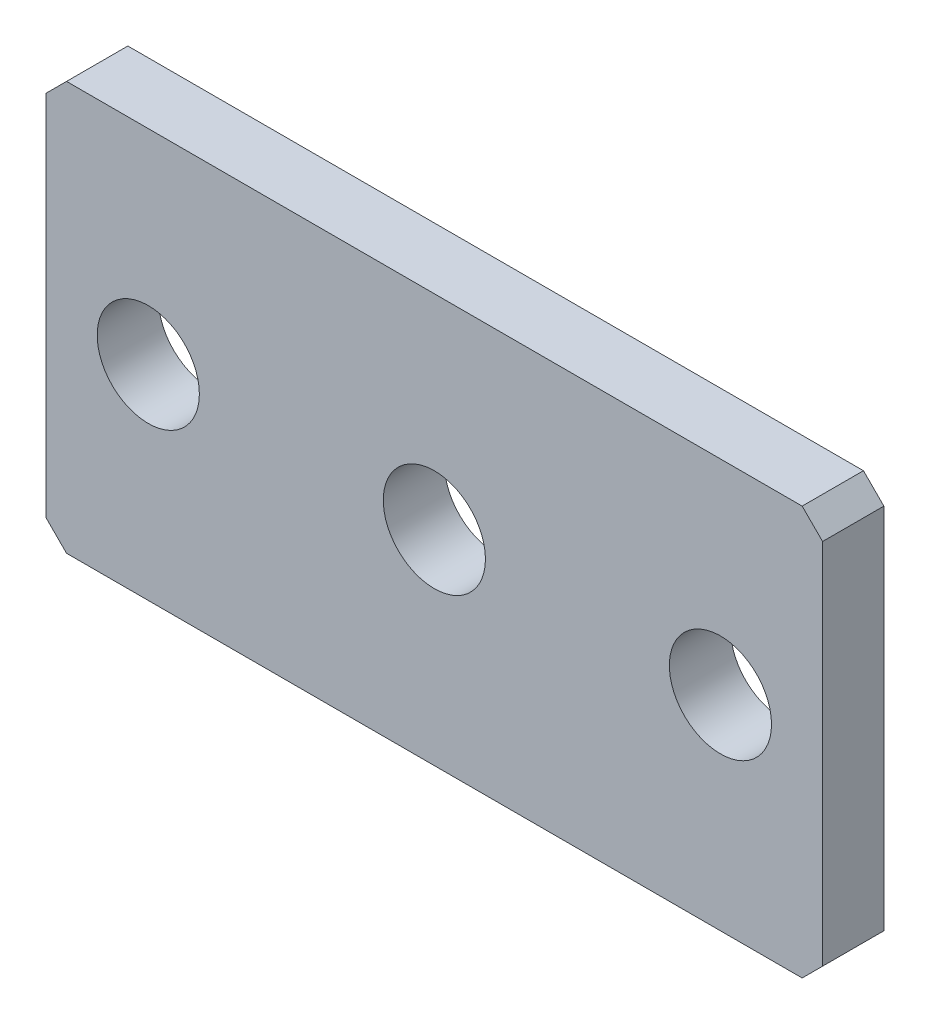
ISO-10303-21;
HEADER;
FILE_DESCRIPTION(('STEP AP214'),'2;1');
FILE_NAME('part.step','',(''),(''),'','','');
FILE_SCHEMA(('AUTOMOTIVE_DESIGN { 1 0 10303 214 1 1 1 1 }'));
ENDSEC;
DATA;
#1=APPLICATION_CONTEXT('core data for automotive mechanical design processes');
#2=APPLICATION_PROTOCOL_DEFINITION('international standard','automotive_design',2000,#1);
#3=PRODUCT_CONTEXT('',#1,'mechanical');
#4=PRODUCT('Part','Part','',(#3));
#5=PRODUCT_RELATED_PRODUCT_CATEGORY('part','',(#4));
#6=PRODUCT_DEFINITION_FORMATION('','',#4);
#7=PRODUCT_DEFINITION_CONTEXT('part definition',#1,'design');
#8=PRODUCT_DEFINITION('design','',#6,#7);
#9=PRODUCT_DEFINITION_SHAPE('','',#8);
#10=(LENGTH_UNIT() NAMED_UNIT(*) SI_UNIT(.MILLI.,.METRE.));
#11=(NAMED_UNIT(*) PLANE_ANGLE_UNIT() SI_UNIT($,.RADIAN.));
#12=(NAMED_UNIT(*) SI_UNIT($,.STERADIAN.) SOLID_ANGLE_UNIT());
#13=UNCERTAINTY_MEASURE_WITH_UNIT(LENGTH_MEASURE(1.E-05),#10,'distance_accuracy_value','');
#14=(GEOMETRIC_REPRESENTATION_CONTEXT(3) GLOBAL_UNCERTAINTY_ASSIGNED_CONTEXT((#13)) GLOBAL_UNIT_ASSIGNED_CONTEXT((#10,
#11,#12)) REPRESENTATION_CONTEXT('',''));
#15=CARTESIAN_POINT('',(0.,0.,0.));
#16=DIRECTION('',(0.,0.,1.));
#17=DIRECTION('',(1.,0.,0.));
#18=AXIS2_PLACEMENT_3D('',#15,#16,#17);
#19=CARTESIAN_POINT('',(-18.,10.,-3.));
#20=DIRECTION('',(-0.707106781186547,0.707106781186548,0.));
#21=DIRECTION('',(-0.707106781186548,-0.707106781186547,0.));
#22=AXIS2_PLACEMENT_3D('',#19,#20,#21);
#23=PLANE('',#22);
#24=DIRECTION('',(-0.707106781186548,-0.707106781186547,0.));
#25=VECTOR('',#24,1.);
#26=CARTESIAN_POINT('',(-18.,10.,0.));
#27=LINE('',#26,#25);
#28=CARTESIAN_POINT('',(-18.,10.,0.));
#29=VERTEX_POINT('',#28);
#30=CARTESIAN_POINT('',(-19.,9.,0.));
#31=VERTEX_POINT('',#30);
#32=EDGE_CURVE('E133',#29,#31,#27,.T.);
#33=ORIENTED_EDGE('',*,*,#32,.F.);
#34=DIRECTION('',(0.,0.,1.));
#35=VECTOR('',#34,1.);
#36=CARTESIAN_POINT('',(-18.,10.,-3.));
#37=LINE('',#36,#35);
#38=CARTESIAN_POINT('',(-18.,10.,-3.));
#39=VERTEX_POINT('',#38);
#40=EDGE_CURVE('E11',#39,#29,#37,.T.);
#41=ORIENTED_EDGE('',*,*,#40,.F.);
#42=DIRECTION('',(-0.707106781186548,-0.707106781186547,0.));
#43=VECTOR('',#42,1.);
#44=CARTESIAN_POINT('',(-18.,10.,-3.));
#45=LINE('',#44,#43);
#46=CARTESIAN_POINT('',(-19.,9.,-3.));
#47=VERTEX_POINT('',#46);
#48=EDGE_CURVE('E154',#39,#47,#45,.T.);
#49=ORIENTED_EDGE('',*,*,#48,.T.);
#50=DIRECTION('',(0.,0.,1.));
#51=VECTOR('',#50,1.);
#52=CARTESIAN_POINT('',(-19.,9.,-3.));
#53=LINE('',#52,#51);
#54=EDGE_CURVE('E39',#47,#31,#53,.T.);
#55=ORIENTED_EDGE('',*,*,#54,.T.);
#56=EDGE_LOOP('',(#33,#41,#49,#55));
#57=FACE_BOUND('',#56,.T.);
#58=ADVANCED_FACE('F36',(#57),#23,.T.);
#59=CARTESIAN_POINT('',(-18.,10.,-3.));
#60=DIRECTION('',(0.,1.,0.));
#61=DIRECTION('',(-1.,0.,0.));
#62=AXIS2_PLACEMENT_3D('',#59,#60,#61);
#63=PLANE('',#62);
#64=DIRECTION('',(-1.,0.,0.));
#65=VECTOR('',#64,1.);
#66=CARTESIAN_POINT('',(-18.,10.,0.));
#67=LINE('',#66,#65);
#68=CARTESIAN_POINT('',(18.,9.99999999999999,0.));
#69=VERTEX_POINT('',#68);
#70=EDGE_CURVE('E152',#69,#29,#67,.T.);
#71=ORIENTED_EDGE('',*,*,#70,.F.);
#72=DIRECTION('',(0.,0.,1.));
#73=VECTOR('',#72,1.);
#74=CARTESIAN_POINT('',(18.,9.99999999999999,-3.));
#75=LINE('',#74,#73);
#76=CARTESIAN_POINT('',(18.,9.99999999999999,-3.));
#77=VERTEX_POINT('',#76);
#78=EDGE_CURVE('E45',#77,#69,#75,.T.);
#79=ORIENTED_EDGE('',*,*,#78,.F.);
#80=DIRECTION('',(-1.,0.,0.));
#81=VECTOR('',#80,1.);
#82=CARTESIAN_POINT('',(-18.,10.,-3.));
#83=LINE('',#82,#81);
#84=EDGE_CURVE('E123',#77,#39,#83,.T.);
#85=ORIENTED_EDGE('',*,*,#84,.T.);
#86=ORIENTED_EDGE('',*,*,#40,.T.);
#87=EDGE_LOOP('',(#71,#79,#85,#86));
#88=FACE_BOUND('',#87,.T.);
#89=ADVANCED_FACE('F166',(#88),#63,.T.);
#90=CARTESIAN_POINT('',(18.,9.99999999999999,-3.));
#91=DIRECTION('',(0.707106781186546,0.707106781186549,0.));
#92=DIRECTION('',(-0.707106781186549,0.707106781186546,0.));
#93=AXIS2_PLACEMENT_3D('',#90,#91,#92);
#94=PLANE('',#93);
#95=DIRECTION('',(-0.707106781186549,0.707106781186546,0.));
#96=VECTOR('',#95,1.);
#97=CARTESIAN_POINT('',(18.,9.99999999999999,0.));
#98=LINE('',#97,#96);
#99=CARTESIAN_POINT('',(19.,9.,0.));
#100=VERTEX_POINT('',#99);
#101=EDGE_CURVE('E110',#100,#69,#98,.T.);
#102=ORIENTED_EDGE('',*,*,#101,.F.);
#103=DIRECTION('',(0.,0.,1.));
#104=VECTOR('',#103,1.);
#105=CARTESIAN_POINT('',(19.,9.,-3.));
#106=LINE('',#105,#104);
#107=CARTESIAN_POINT('',(19.,9.,-3.));
#108=VERTEX_POINT('',#107);
#109=EDGE_CURVE('E105',#108,#100,#106,.T.);
#110=ORIENTED_EDGE('',*,*,#109,.F.);
#111=DIRECTION('',(-0.707106781186549,0.707106781186546,0.));
#112=VECTOR('',#111,1.);
#113=CARTESIAN_POINT('',(18.,9.99999999999999,-3.));
#114=LINE('',#113,#112);
#115=EDGE_CURVE('E108',#108,#77,#114,.T.);
#116=ORIENTED_EDGE('',*,*,#115,.T.);
#117=ORIENTED_EDGE('',*,*,#78,.T.);
#118=EDGE_LOOP('',(#102,#110,#116,#117));
#119=FACE_BOUND('',#118,.T.);
#120=ADVANCED_FACE('F107',(#119),#94,.T.);
#121=CARTESIAN_POINT('',(19.,9.,-3.));
#122=DIRECTION('',(1.,0.,0.));
#123=DIRECTION('',(0.,1.,0.));
#124=AXIS2_PLACEMENT_3D('',#121,#122,#123);
#125=PLANE('',#124);
#126=DIRECTION('',(0.,1.,0.));
#127=VECTOR('',#126,1.);
#128=CARTESIAN_POINT('',(19.,9.,0.));
#129=LINE('',#128,#127);
#130=CARTESIAN_POINT('',(19.,-9.,0.));
#131=VERTEX_POINT('',#130);
#132=EDGE_CURVE('E149',#131,#100,#129,.T.);
#133=ORIENTED_EDGE('',*,*,#132,.F.);
#134=DIRECTION('',(0.,0.,1.));
#135=VECTOR('',#134,1.);
#136=CARTESIAN_POINT('',(19.,-9.,-3.));
#137=LINE('',#136,#135);
#138=CARTESIAN_POINT('',(19.,-9.,-3.));
#139=VERTEX_POINT('',#138);
#140=EDGE_CURVE('E115',#139,#131,#137,.T.);
#141=ORIENTED_EDGE('',*,*,#140,.F.);
#142=DIRECTION('',(0.,1.,0.));
#143=VECTOR('',#142,1.);
#144=CARTESIAN_POINT('',(19.,9.,-3.));
#145=LINE('',#144,#143);
#146=EDGE_CURVE('E121',#139,#108,#145,.T.);
#147=ORIENTED_EDGE('',*,*,#146,.T.);
#148=ORIENTED_EDGE('',*,*,#109,.T.);
#149=EDGE_LOOP('',(#133,#141,#147,#148));
#150=FACE_BOUND('',#149,.T.);
#151=ADVANCED_FACE('F125',(#150),#125,.T.);
#152=CARTESIAN_POINT('',(19.,-9.,-3.));
#153=DIRECTION('',(0.707106781186546,-0.707106781186549,0.));
#154=DIRECTION('',(0.707106781186549,0.707106781186546,0.));
#155=AXIS2_PLACEMENT_3D('',#152,#153,#154);
#156=PLANE('',#155);
#157=DIRECTION('',(0.707106781186549,0.707106781186546,0.));
#158=VECTOR('',#157,1.);
#159=CARTESIAN_POINT('',(19.,-9.,0.));
#160=LINE('',#159,#158);
#161=CARTESIAN_POINT('',(18.,-10.,0.));
#162=VERTEX_POINT('',#161);
#163=EDGE_CURVE('E146',#162,#131,#160,.T.);
#164=ORIENTED_EDGE('',*,*,#163,.F.);
#165=DIRECTION('',(0.,0.,1.));
#166=VECTOR('',#165,1.);
#167=CARTESIAN_POINT('',(18.,-10.,-3.));
#168=LINE('',#167,#166);
#169=CARTESIAN_POINT('',(18.,-10.,-3.));
#170=VERTEX_POINT('',#169);
#171=EDGE_CURVE('E158',#170,#162,#168,.T.);
#172=ORIENTED_EDGE('',*,*,#171,.F.);
#173=DIRECTION('',(0.707106781186549,0.707106781186546,0.));
#174=VECTOR('',#173,1.);
#175=CARTESIAN_POINT('',(19.,-9.,-3.));
#176=LINE('',#175,#174);
#177=EDGE_CURVE('E126',#170,#139,#176,.T.);
#178=ORIENTED_EDGE('',*,*,#177,.T.);
#179=ORIENTED_EDGE('',*,*,#140,.T.);
#180=EDGE_LOOP('',(#164,#172,#178,#179));
#181=FACE_BOUND('',#180,.T.);
#182=ADVANCED_FACE('F179',(#181),#156,.T.);
#183=CARTESIAN_POINT('',(-18.,-10.,-3.));
#184=DIRECTION('',(0.,-1.,0.));
#185=DIRECTION('',(1.,0.,0.));
#186=AXIS2_PLACEMENT_3D('',#183,#184,#185);
#187=PLANE('',#186);
#188=DIRECTION('',(1.,0.,0.));
#189=VECTOR('',#188,1.);
#190=CARTESIAN_POINT('',(-18.,-10.,0.));
#191=LINE('',#190,#189);
#192=CARTESIAN_POINT('',(-18.,-10.,0.));
#193=VERTEX_POINT('',#192);
#194=EDGE_CURVE('E143',#193,#162,#191,.T.);
#195=ORIENTED_EDGE('',*,*,#194,.F.);
#196=DIRECTION('',(0.,0.,1.));
#197=VECTOR('',#196,1.);
#198=CARTESIAN_POINT('',(-18.,-10.,-3.));
#199=LINE('',#198,#197);
#200=CARTESIAN_POINT('',(-18.,-10.,-3.));
#201=VERTEX_POINT('',#200);
#202=EDGE_CURVE('E160',#201,#193,#199,.T.);
#203=ORIENTED_EDGE('',*,*,#202,.F.);
#204=DIRECTION('',(1.,0.,0.));
#205=VECTOR('',#204,1.);
#206=CARTESIAN_POINT('',(-18.,-10.,-3.));
#207=LINE('',#206,#205);
#208=EDGE_CURVE('E128',#201,#170,#207,.T.);
#209=ORIENTED_EDGE('',*,*,#208,.T.);
#210=ORIENTED_EDGE('',*,*,#171,.T.);
#211=EDGE_LOOP('',(#195,#203,#209,#210));
#212=FACE_BOUND('',#211,.T.);
#213=ADVANCED_FACE('F182',(#212),#187,.T.);
#214=CARTESIAN_POINT('',(-19.,-9.00000000000001,-3.));
#215=DIRECTION('',(-0.707106781186547,-0.707106781186548,0.));
#216=DIRECTION('',(0.707106781186548,-0.707106781186547,0.));
#217=AXIS2_PLACEMENT_3D('',#214,#215,#216);
#218=PLANE('',#217);
#219=DIRECTION('',(0.707106781186548,-0.707106781186547,0.));
#220=VECTOR('',#219,1.);
#221=CARTESIAN_POINT('',(-19.,-9.00000000000001,0.));
#222=LINE('',#221,#220);
#223=CARTESIAN_POINT('',(-19.,-9.00000000000001,0.));
#224=VERTEX_POINT('',#223);
#225=EDGE_CURVE('E140',#224,#193,#222,.T.);
#226=ORIENTED_EDGE('',*,*,#225,.F.);
#227=DIRECTION('',(0.,0.,1.));
#228=VECTOR('',#227,1.);
#229=CARTESIAN_POINT('',(-19.,-9.00000000000001,-3.));
#230=LINE('',#229,#228);
#231=CARTESIAN_POINT('',(-19.,-9.00000000000001,-3.));
#232=VERTEX_POINT('',#231);
#233=EDGE_CURVE('E161',#232,#224,#230,.T.);
#234=ORIENTED_EDGE('',*,*,#233,.F.);
#235=DIRECTION('',(0.707106781186548,-0.707106781186547,0.));
#236=VECTOR('',#235,1.);
#237=CARTESIAN_POINT('',(-19.,-9.00000000000001,-3.));
#238=LINE('',#237,#236);
#239=EDGE_CURVE('E238',#232,#201,#238,.T.);
#240=ORIENTED_EDGE('',*,*,#239,.T.);
#241=ORIENTED_EDGE('',*,*,#202,.T.);
#242=EDGE_LOOP('',(#226,#234,#240,#241));
#243=FACE_BOUND('',#242,.T.);
#244=ADVANCED_FACE('F186',(#243),#218,.T.);
#245=CARTESIAN_POINT('',(-19.,9.,-3.));
#246=DIRECTION('',(-1.,0.,0.));
#247=DIRECTION('',(0.,-1.,0.));
#248=AXIS2_PLACEMENT_3D('',#245,#246,#247);
#249=PLANE('',#248);
#250=DIRECTION('',(0.,-1.,0.));
#251=VECTOR('',#250,1.);
#252=CARTESIAN_POINT('',(-19.,9.,0.));
#253=LINE('',#252,#251);
#254=EDGE_CURVE('E136',#31,#224,#253,.T.);
#255=ORIENTED_EDGE('',*,*,#254,.F.);
#256=ORIENTED_EDGE('',*,*,#54,.F.);
#257=DIRECTION('',(0.,-1.,0.));
#258=VECTOR('',#257,1.);
#259=CARTESIAN_POINT('',(-19.,9.,-3.));
#260=LINE('',#259,#258);
#261=EDGE_CURVE('E236',#47,#232,#260,.T.);
#262=ORIENTED_EDGE('',*,*,#261,.T.);
#263=ORIENTED_EDGE('',*,*,#233,.T.);
#264=EDGE_LOOP('',(#255,#256,#262,#263));
#265=FACE_BOUND('',#264,.T.);
#266=ADVANCED_FACE('F163',(#265),#249,.T.);
#267=CARTESIAN_POINT('',(0.,0.,-3.));
#268=DIRECTION('',(0.,0.,1.));
#269=DIRECTION('',(1.,0.,0.));
#270=AXIS2_PLACEMENT_3D('',#267,#268,#269);
#271=PLANE('',#270);
#272=CARTESIAN_POINT('',(0.,0.,-3.));
#273=DIRECTION('',(0.,0.,1.));
#274=DIRECTION('',(1.,0.,0.));
#275=AXIS2_PLACEMENT_3D('',#272,#273,#274);
#276=CIRCLE('',#275,2.49999999999999);
#277=CARTESIAN_POINT('',(2.49999999999999,0.,-3.));
#278=VERTEX_POINT('',#277);
#279=EDGE_CURVE('E220',#278,#278,#276,.T.);
#280=ORIENTED_EDGE('',*,*,#279,.T.);
#281=EDGE_LOOP('',(#280));
#282=FACE_BOUND('',#281,.T.);
#283=CARTESIAN_POINT('',(14.,0.,-3.));
#284=DIRECTION('',(0.,0.,1.));
#285=DIRECTION('',(1.,0.,0.));
#286=AXIS2_PLACEMENT_3D('',#283,#284,#285);
#287=CIRCLE('',#286,2.5);
#288=CARTESIAN_POINT('',(16.5,0.,-3.));
#289=VERTEX_POINT('',#288);
#290=EDGE_CURVE('E224',#289,#289,#287,.T.);
#291=ORIENTED_EDGE('',*,*,#290,.T.);
#292=EDGE_LOOP('',(#291));
#293=FACE_BOUND('',#292,.T.);
#294=CARTESIAN_POINT('',(-14.,0.,-3.));
#295=DIRECTION('',(0.,0.,1.));
#296=DIRECTION('',(1.,0.,0.));
#297=AXIS2_PLACEMENT_3D('',#294,#295,#296);
#298=CIRCLE('',#297,2.5);
#299=CARTESIAN_POINT('',(-11.5,0.,-3.));
#300=VERTEX_POINT('',#299);
#301=EDGE_CURVE('E137',#300,#300,#298,.T.);
#302=ORIENTED_EDGE('',*,*,#301,.T.);
#303=EDGE_LOOP('',(#302));
#304=FACE_BOUND('',#303,.T.);
#305=ORIENTED_EDGE('',*,*,#48,.F.);
#306=ORIENTED_EDGE('',*,*,#84,.F.);
#307=ORIENTED_EDGE('',*,*,#115,.F.);
#308=ORIENTED_EDGE('',*,*,#146,.F.);
#309=ORIENTED_EDGE('',*,*,#177,.F.);
#310=ORIENTED_EDGE('',*,*,#208,.F.);
#311=ORIENTED_EDGE('',*,*,#239,.F.);
#312=ORIENTED_EDGE('',*,*,#261,.F.);
#313=EDGE_LOOP('',(#305,#306,#307,#308,#309,#310,#311,#312));
#314=FACE_BOUND('',#313,.T.);
#315=ADVANCED_FACE('F119',(#282,#293,#304,#314),#271,.F.);
#316=CARTESIAN_POINT('',(0.,0.,0.));
#317=DIRECTION('',(0.,0.,1.));
#318=DIRECTION('',(1.,0.,0.));
#319=AXIS2_PLACEMENT_3D('',#316,#317,#318);
#320=PLANE('',#319);
#321=CARTESIAN_POINT('',(0.,0.,0.));
#322=DIRECTION('',(0.,0.,1.));
#323=DIRECTION('',(1.,0.,0.));
#324=AXIS2_PLACEMENT_3D('',#321,#322,#323);
#325=CIRCLE('',#324,2.49999999999999);
#326=CARTESIAN_POINT('',(2.49999999999999,0.,0.));
#327=VERTEX_POINT('',#326);
#328=EDGE_CURVE('E218',#327,#327,#325,.T.);
#329=ORIENTED_EDGE('',*,*,#328,.F.);
#330=EDGE_LOOP('',(#329));
#331=FACE_BOUND('',#330,.T.);
#332=CARTESIAN_POINT('',(14.,0.,0.));
#333=DIRECTION('',(0.,0.,1.));
#334=DIRECTION('',(1.,0.,0.));
#335=AXIS2_PLACEMENT_3D('',#332,#333,#334);
#336=CIRCLE('',#335,2.5);
#337=CARTESIAN_POINT('',(16.5,0.,0.));
#338=VERTEX_POINT('',#337);
#339=EDGE_CURVE('E221',#338,#338,#336,.T.);
#340=ORIENTED_EDGE('',*,*,#339,.F.);
#341=EDGE_LOOP('',(#340));
#342=FACE_BOUND('',#341,.T.);
#343=CARTESIAN_POINT('',(-14.,0.,0.));
#344=DIRECTION('',(0.,0.,1.));
#345=DIRECTION('',(1.,0.,0.));
#346=AXIS2_PLACEMENT_3D('',#343,#344,#345);
#347=CIRCLE('',#346,2.5);
#348=CARTESIAN_POINT('',(-11.5,0.,0.));
#349=VERTEX_POINT('',#348);
#350=EDGE_CURVE('E229',#349,#349,#347,.T.);
#351=ORIENTED_EDGE('',*,*,#350,.F.);
#352=EDGE_LOOP('',(#351));
#353=FACE_BOUND('',#352,.T.);
#354=ORIENTED_EDGE('',*,*,#32,.T.);
#355=ORIENTED_EDGE('',*,*,#254,.T.);
#356=ORIENTED_EDGE('',*,*,#225,.T.);
#357=ORIENTED_EDGE('',*,*,#194,.T.);
#358=ORIENTED_EDGE('',*,*,#163,.T.);
#359=ORIENTED_EDGE('',*,*,#132,.T.);
#360=ORIENTED_EDGE('',*,*,#101,.T.);
#361=ORIENTED_EDGE('',*,*,#70,.T.);
#362=EDGE_LOOP('',(#354,#355,#356,#357,#358,#359,#360,#361));
#363=FACE_BOUND('',#362,.T.);
#364=ADVANCED_FACE('F165',(#331,#342,#353,#363),#320,.T.);
#365=CARTESIAN_POINT('',(-14.,0.,-3.));
#366=DIRECTION('',(0.,0.,1.));
#367=DIRECTION('',(1.,0.,0.));
#368=AXIS2_PLACEMENT_3D('',#365,#366,#367);
#369=CYLINDRICAL_SURFACE('',#368,2.5);
#370=ORIENTED_EDGE('',*,*,#301,.F.);
#371=EDGE_LOOP('',(#370));
#372=FACE_BOUND('',#371,.T.);
#373=ORIENTED_EDGE('',*,*,#350,.T.);
#374=EDGE_LOOP('',(#373));
#375=FACE_BOUND('',#374,.T.);
#376=ADVANCED_FACE('F198',(#372,#375),#369,.F.);
#377=CARTESIAN_POINT('',(14.,0.,-3.));
#378=DIRECTION('',(0.,0.,1.));
#379=DIRECTION('',(1.,0.,0.));
#380=AXIS2_PLACEMENT_3D('',#377,#378,#379);
#381=CYLINDRICAL_SURFACE('',#380,2.5);
#382=ORIENTED_EDGE('',*,*,#290,.F.);
#383=EDGE_LOOP('',(#382));
#384=FACE_BOUND('',#383,.T.);
#385=ORIENTED_EDGE('',*,*,#339,.T.);
#386=EDGE_LOOP('',(#385));
#387=FACE_BOUND('',#386,.T.);
#388=ADVANCED_FACE('F205',(#384,#387),#381,.F.);
#389=CARTESIAN_POINT('',(0.,0.,0.));
#390=DIRECTION('',(0.,0.,1.));
#391=DIRECTION('',(1.,0.,0.));
#392=AXIS2_PLACEMENT_3D('',#389,#390,#391);
#393=CYLINDRICAL_SURFACE('',#392,2.49999999999999);
#394=ORIENTED_EDGE('',*,*,#328,.T.);
#395=EDGE_LOOP('',(#394));
#396=FACE_BOUND('',#395,.T.);
#397=ORIENTED_EDGE('',*,*,#279,.F.);
#398=EDGE_LOOP('',(#397));
#399=FACE_BOUND('',#398,.T.);
#400=ADVANCED_FACE('F209',(#396,#399),#393,.F.);
#401=CLOSED_SHELL('',(#58,#89,#120,#151,#182,#213,#244,#266,#315,#364,#376,#388,#400));
#402=MANIFOLD_SOLID_BREP('B2',#401);
#403=ADVANCED_BREP_SHAPE_REPRESENTATION('',(#18,#402),#14);
#404=SHAPE_DEFINITION_REPRESENTATION(#9,#403);
ENDSEC;
END-ISO-10303-21;
